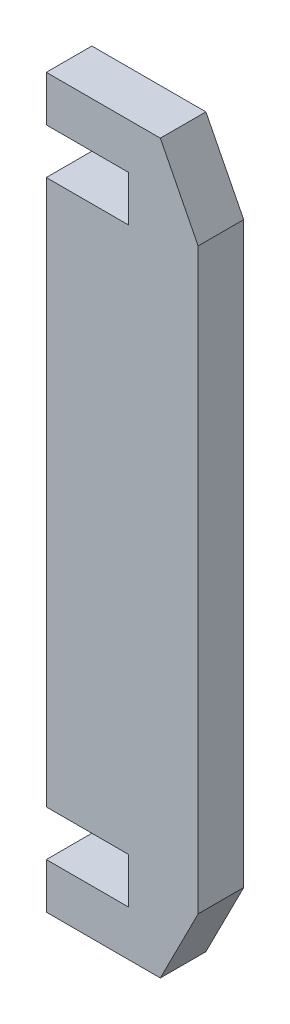
ISO-10303-21;
HEADER;
FILE_DESCRIPTION(('STEP AP214'),'2;1');
FILE_NAME('part.step','',(''),(''),'','','');
FILE_SCHEMA(('AUTOMOTIVE_DESIGN { 1 0 10303 214 1 1 1 1 }'));
ENDSEC;
DATA;
#1=APPLICATION_CONTEXT('core data for automotive mechanical design processes');
#2=APPLICATION_PROTOCOL_DEFINITION('international standard','automotive_design',2000,#1);
#3=PRODUCT_CONTEXT('',#1,'mechanical');
#4=PRODUCT('Part','Part','',(#3));
#5=PRODUCT_RELATED_PRODUCT_CATEGORY('part','',(#4));
#6=PRODUCT_DEFINITION_FORMATION('','',#4);
#7=PRODUCT_DEFINITION_CONTEXT('part definition',#1,'design');
#8=PRODUCT_DEFINITION('design','',#6,#7);
#9=PRODUCT_DEFINITION_SHAPE('','',#8);
#10=(LENGTH_UNIT() NAMED_UNIT(*) SI_UNIT(.MILLI.,.METRE.));
#11=(NAMED_UNIT(*) PLANE_ANGLE_UNIT() SI_UNIT($,.RADIAN.));
#12=(NAMED_UNIT(*) SI_UNIT($,.STERADIAN.) SOLID_ANGLE_UNIT());
#13=UNCERTAINTY_MEASURE_WITH_UNIT(LENGTH_MEASURE(1.E-05),#10,'distance_accuracy_value','');
#14=(GEOMETRIC_REPRESENTATION_CONTEXT(3) GLOBAL_UNCERTAINTY_ASSIGNED_CONTEXT((#13)) GLOBAL_UNIT_ASSIGNED_CONTEXT((#10,
#11,#12)) REPRESENTATION_CONTEXT('',''));
#15=CARTESIAN_POINT('',(0.,0.,0.));
#16=DIRECTION('',(0.,0.,1.));
#17=DIRECTION('',(1.,0.,0.));
#18=AXIS2_PLACEMENT_3D('',#15,#16,#17);
#19=CARTESIAN_POINT('',(872.909650659041,-119.420281102251,3.00000000000013));
#20=DIRECTION('',(0.,1.,0.));
#21=DIRECTION('',(0.,0.,0.999999999999999));
#22=AXIS2_PLACEMENT_3D('',#19,#20,#21);
#23=PLANE('',#22);
#24=DIRECTION('',(1.,0.,0.));
#25=VECTOR('',#24,1.);
#26=CARTESIAN_POINT('',(872.909650659041,-119.420281102251,1.45716771982052E-13));
#27=LINE('',#26,#25);
#28=CARTESIAN_POINT('',(872.909650659041,-119.420281102251,1.45716771982052E-13));
#29=VERTEX_POINT('',#28);
#30=CARTESIAN_POINT('',(880.419804328036,-119.420281102251,0.));
#31=VERTEX_POINT('',#30);
#32=EDGE_CURVE('E136',#29,#31,#27,.T.);
#33=ORIENTED_EDGE('',*,*,#32,.T.);
#34=DIRECTION('',(0.,0.,-0.999999999999999));
#35=VECTOR('',#34,1.);
#36=CARTESIAN_POINT('',(880.419804328036,-119.420281102251,3.00000000000008));
#37=LINE('',#36,#35);
#38=CARTESIAN_POINT('',(880.419804328036,-119.420281102251,3.00000000000008));
#39=VERTEX_POINT('',#38);
#40=EDGE_CURVE('E11',#39,#31,#37,.T.);
#41=ORIENTED_EDGE('',*,*,#40,.F.);
#42=DIRECTION('',(1.,0.,0.));
#43=VECTOR('',#42,1.);
#44=CARTESIAN_POINT('',(872.909650659041,-119.420281102251,3.00000000000013));
#45=LINE('',#44,#43);
#46=CARTESIAN_POINT('',(872.909650659041,-119.420281102251,3.00000000000013));
#47=VERTEX_POINT('',#46);
#48=EDGE_CURVE('E176',#47,#39,#45,.T.);
#49=ORIENTED_EDGE('',*,*,#48,.F.);
#50=DIRECTION('',(0.,0.,-0.999999999999999));
#51=VECTOR('',#50,1.);
#52=CARTESIAN_POINT('',(872.909650659041,-119.420281102251,3.00000000000013));
#53=LINE('',#52,#51);
#54=EDGE_CURVE('E149',#47,#29,#53,.T.);
#55=ORIENTED_EDGE('',*,*,#54,.T.);
#56=EDGE_LOOP('',(#33,#41,#49,#55));
#57=FACE_BOUND('',#56,.T.);
#58=ADVANCED_FACE('F32',(#57),#23,.F.);
#59=CARTESIAN_POINT('',(880.419804328036,-119.420281102251,3.00000000000008));
#60=DIRECTION('',(-0.891625628701499,0.452773385086465,0.));
#61=DIRECTION('',(-0.452773385086465,-0.891625628701499,0.));
#62=AXIS2_PLACEMENT_3D('',#59,#60,#61);
#63=PLANE('',#62);
#64=DIRECTION('',(0.452773385086465,0.891625628701499,0.));
#65=VECTOR('',#64,1.);
#66=CARTESIAN_POINT('',(880.419804328036,-119.420281102251,0.));
#67=LINE('',#66,#65);
#68=CARTESIAN_POINT('',(882.909650659041,-114.517142195734,1.38777878078145E-13));
#69=VERTEX_POINT('',#68);
#70=EDGE_CURVE('E132',#31,#69,#67,.T.);
#71=ORIENTED_EDGE('',*,*,#70,.T.);
#72=DIRECTION('',(0.,0.,-0.999999999999999));
#73=VECTOR('',#72,1.);
#74=CARTESIAN_POINT('',(882.909650659041,-114.517142195734,3.0000000000001));
#75=LINE('',#74,#73);
#76=CARTESIAN_POINT('',(882.909650659041,-114.517142195734,3.0000000000001));
#77=VERTEX_POINT('',#76);
#78=EDGE_CURVE('E39',#77,#69,#75,.T.);
#79=ORIENTED_EDGE('',*,*,#78,.F.);
#80=DIRECTION('',(0.452773385086465,0.891625628701499,0.));
#81=VECTOR('',#80,1.);
#82=CARTESIAN_POINT('',(880.419804328036,-119.420281102251,3.00000000000008));
#83=LINE('',#82,#81);
#84=EDGE_CURVE('E145',#39,#77,#83,.T.);
#85=ORIENTED_EDGE('',*,*,#84,.F.);
#86=ORIENTED_EDGE('',*,*,#40,.T.);
#87=EDGE_LOOP('',(#71,#79,#85,#86));
#88=FACE_BOUND('',#87,.T.);
#89=ADVANCED_FACE('F144',(#88),#63,.F.);
#90=CARTESIAN_POINT('',(882.909650659041,-114.517142195734,3.0000000000001));
#91=DIRECTION('',(-1.,0.,0.));
#92=DIRECTION('',(0.,0.,0.999999999999999));
#93=AXIS2_PLACEMENT_3D('',#90,#91,#92);
#94=PLANE('',#93);
#95=DIRECTION('',(0.,1.,0.));
#96=VECTOR('',#95,1.);
#97=CARTESIAN_POINT('',(882.909650659041,-114.517142195734,1.38777878078145E-13));
#98=LINE('',#97,#96);
#99=CARTESIAN_POINT('',(882.909650659041,-76.4234200087673,0.));
#100=VERTEX_POINT('',#99);
#101=EDGE_CURVE('E138',#69,#100,#98,.T.);
#102=ORIENTED_EDGE('',*,*,#101,.T.);
#103=DIRECTION('',(0.,0.,-0.999999999999999));
#104=VECTOR('',#103,1.);
#105=CARTESIAN_POINT('',(882.909650659041,-76.4234200087673,3.00000000000007));
#106=LINE('',#105,#104);
#107=CARTESIAN_POINT('',(882.909650659041,-76.4234200087673,3.00000000000007));
#108=VERTEX_POINT('',#107);
#109=EDGE_CURVE('E232',#108,#100,#106,.T.);
#110=ORIENTED_EDGE('',*,*,#109,.F.);
#111=DIRECTION('',(0.,1.,0.));
#112=VECTOR('',#111,1.);
#113=CARTESIAN_POINT('',(882.909650659041,-114.517142195734,3.0000000000001));
#114=LINE('',#113,#112);
#115=EDGE_CURVE('E179',#77,#108,#114,.T.);
#116=ORIENTED_EDGE('',*,*,#115,.F.);
#117=ORIENTED_EDGE('',*,*,#78,.T.);
#118=EDGE_LOOP('',(#102,#110,#116,#117));
#119=FACE_BOUND('',#118,.T.);
#120=ADVANCED_FACE('F236',(#119),#94,.F.);
#121=CARTESIAN_POINT('',(880.419804328036,-71.5202811022506,3.00000000000005));
#122=DIRECTION('',(-0.891625628701499,-0.452773385086465,0.));
#123=DIRECTION('',(0.452773385086465,-0.891625628701499,0.));
#124=AXIS2_PLACEMENT_3D('',#121,#122,#123);
#125=PLANE('',#124);
#126=DIRECTION('',(-0.452773385086465,0.891625628701499,0.));
#127=VECTOR('',#126,1.);
#128=CARTESIAN_POINT('',(880.419804328036,-71.5202811022506,0.));
#129=LINE('',#128,#127);
#130=CARTESIAN_POINT('',(880.419804328036,-71.5202811022506,0.));
#131=VERTEX_POINT('',#130);
#132=EDGE_CURVE('E153',#100,#131,#129,.T.);
#133=ORIENTED_EDGE('',*,*,#132,.T.);
#134=DIRECTION('',(0.,0.,-0.999999999999999));
#135=VECTOR('',#134,1.);
#136=CARTESIAN_POINT('',(880.419804328036,-71.5202811022506,3.00000000000005));
#137=LINE('',#136,#135);
#138=CARTESIAN_POINT('',(880.419804328036,-71.5202811022506,3.00000000000005));
#139=VERTEX_POINT('',#138);
#140=EDGE_CURVE('E229',#139,#131,#137,.T.);
#141=ORIENTED_EDGE('',*,*,#140,.F.);
#142=DIRECTION('',(-0.452773385086465,0.891625628701499,0.));
#143=VECTOR('',#142,1.);
#144=CARTESIAN_POINT('',(880.419804328036,-71.5202811022506,3.00000000000005));
#145=LINE('',#144,#143);
#146=EDGE_CURVE('E181',#108,#139,#145,.T.);
#147=ORIENTED_EDGE('',*,*,#146,.F.);
#148=ORIENTED_EDGE('',*,*,#109,.T.);
#149=EDGE_LOOP('',(#133,#141,#147,#148));
#150=FACE_BOUND('',#149,.T.);
#151=ADVANCED_FACE('F244',(#150),#125,.F.);
#152=CARTESIAN_POINT('',(872.909650659041,-71.5202811022506,3.00000000000014));
#153=DIRECTION('',(0.,-1.,0.));
#154=DIRECTION('',(0.,0.,-0.999999999999999));
#155=AXIS2_PLACEMENT_3D('',#152,#153,#154);
#156=PLANE('',#155);
#157=DIRECTION('',(-1.,0.,0.));
#158=VECTOR('',#157,1.);
#159=CARTESIAN_POINT('',(872.909650659041,-71.5202811022506,1.2490009027033E-13));
#160=LINE('',#159,#158);
#161=CARTESIAN_POINT('',(872.909650659041,-71.5202811022506,1.2490009027033E-13));
#162=VERTEX_POINT('',#161);
#163=EDGE_CURVE('E155',#131,#162,#160,.T.);
#164=ORIENTED_EDGE('',*,*,#163,.T.);
#165=DIRECTION('',(0.,0.,-0.999999999999999));
#166=VECTOR('',#165,1.);
#167=CARTESIAN_POINT('',(872.909650659041,-71.5202811022506,3.00000000000014));
#168=LINE('',#167,#166);
#169=CARTESIAN_POINT('',(872.909650659041,-71.5202811022506,3.00000000000014));
#170=VERTEX_POINT('',#169);
#171=EDGE_CURVE('E226',#170,#162,#168,.T.);
#172=ORIENTED_EDGE('',*,*,#171,.F.);
#173=DIRECTION('',(-1.,0.,0.));
#174=VECTOR('',#173,1.);
#175=CARTESIAN_POINT('',(872.909650659041,-71.5202811022506,3.00000000000014));
#176=LINE('',#175,#174);
#177=EDGE_CURVE('E183',#139,#170,#176,.T.);
#178=ORIENTED_EDGE('',*,*,#177,.F.);
#179=ORIENTED_EDGE('',*,*,#140,.T.);
#180=EDGE_LOOP('',(#164,#172,#178,#179));
#181=FACE_BOUND('',#180,.T.);
#182=ADVANCED_FACE('F247',(#181),#156,.F.);
#183=CARTESIAN_POINT('',(872.909650659041,-71.5202811022506,3.00000000000014));
#184=DIRECTION('',(1.,0.,0.));
#185=DIRECTION('',(0.,0.,-0.999999999999999));
#186=AXIS2_PLACEMENT_3D('',#183,#184,#185);
#187=PLANE('',#186);
#188=DIRECTION('',(0.,-1.,0.));
#189=VECTOR('',#188,1.);
#190=CARTESIAN_POINT('',(872.909650659041,-71.5202811022506,1.2490009027033E-13));
#191=LINE('',#190,#189);
#192=CARTESIAN_POINT('',(872.909650659041,-74.5202811022506,1.31838984174237E-13));
#193=VERTEX_POINT('',#192);
#194=EDGE_CURVE('E157',#162,#193,#191,.T.);
#195=ORIENTED_EDGE('',*,*,#194,.T.);
#196=DIRECTION('',(0.,0.,-0.999999999999999));
#197=VECTOR('',#196,1.);
#198=CARTESIAN_POINT('',(872.909650659041,-74.5202811022506,3.0000000000001));
#199=LINE('',#198,#197);
#200=CARTESIAN_POINT('',(872.909650659041,-74.5202811022506,3.0000000000001));
#201=VERTEX_POINT('',#200);
#202=EDGE_CURVE('E223',#201,#193,#199,.T.);
#203=ORIENTED_EDGE('',*,*,#202,.F.);
#204=DIRECTION('',(0.,-1.,0.));
#205=VECTOR('',#204,1.);
#206=CARTESIAN_POINT('',(872.909650659041,-71.5202811022506,3.00000000000014));
#207=LINE('',#206,#205);
#208=EDGE_CURVE('E185',#170,#201,#207,.T.);
#209=ORIENTED_EDGE('',*,*,#208,.F.);
#210=ORIENTED_EDGE('',*,*,#171,.T.);
#211=EDGE_LOOP('',(#195,#203,#209,#210));
#212=FACE_BOUND('',#211,.T.);
#213=ADVANCED_FACE('F252',(#212),#187,.F.);
#214=CARTESIAN_POINT('',(878.318576624196,-74.5202811022506,3.00000000000013));
#215=DIRECTION('',(0.,1.,0.));
#216=DIRECTION('',(0.,0.,0.999999999999999));
#217=AXIS2_PLACEMENT_3D('',#214,#215,#216);
#218=PLANE('',#217);
#219=DIRECTION('',(1.,0.,0.));
#220=VECTOR('',#219,1.);
#221=CARTESIAN_POINT('',(878.318576624196,-74.5202811022506,1.66533453693773E-13));
#222=LINE('',#221,#220);
#223=CARTESIAN_POINT('',(878.318576624196,-74.5202811022506,1.66533453693773E-13));
#224=VERTEX_POINT('',#223);
#225=EDGE_CURVE('E159',#193,#224,#222,.T.);
#226=ORIENTED_EDGE('',*,*,#225,.T.);
#227=DIRECTION('',(0.,0.,-0.999999999999999));
#228=VECTOR('',#227,1.);
#229=CARTESIAN_POINT('',(878.318576624196,-74.5202811022506,3.00000000000013));
#230=LINE('',#229,#228);
#231=CARTESIAN_POINT('',(878.318576624196,-74.5202811022506,3.00000000000013));
#232=VERTEX_POINT('',#231);
#233=EDGE_CURVE('E220',#232,#224,#230,.T.);
#234=ORIENTED_EDGE('',*,*,#233,.F.);
#235=DIRECTION('',(1.,0.,0.));
#236=VECTOR('',#235,1.);
#237=CARTESIAN_POINT('',(878.318576624196,-74.5202811022506,3.00000000000013));
#238=LINE('',#237,#236);
#239=EDGE_CURVE('E187',#201,#232,#238,.T.);
#240=ORIENTED_EDGE('',*,*,#239,.F.);
#241=ORIENTED_EDGE('',*,*,#202,.T.);
#242=EDGE_LOOP('',(#226,#234,#240,#241));
#243=FACE_BOUND('',#242,.T.);
#244=ADVANCED_FACE('F258',(#243),#218,.F.);
#245=CARTESIAN_POINT('',(878.318576624196,-74.5202811022506,3.00000000000013));
#246=DIRECTION('',(1.,0.,0.));
#247=DIRECTION('',(0.,0.,-0.999999999999999));
#248=AXIS2_PLACEMENT_3D('',#245,#246,#247);
#249=PLANE('',#248);
#250=DIRECTION('',(0.,-1.,0.));
#251=VECTOR('',#250,1.);
#252=CARTESIAN_POINT('',(878.318576624196,-74.5202811022506,1.66533453693773E-13));
#253=LINE('',#252,#251);
#254=CARTESIAN_POINT('',(878.318576624196,-77.5202811022506,1.52655665885959E-13));
#255=VERTEX_POINT('',#254);
#256=EDGE_CURVE('E161',#224,#255,#253,.T.);
#257=ORIENTED_EDGE('',*,*,#256,.T.);
#258=DIRECTION('',(0.,0.,-0.999999999999999));
#259=VECTOR('',#258,1.);
#260=CARTESIAN_POINT('',(878.318576624196,-77.5202811022506,3.00000000000014));
#261=LINE('',#260,#259);
#262=CARTESIAN_POINT('',(878.318576624196,-77.5202811022506,3.00000000000014));
#263=VERTEX_POINT('',#262);
#264=EDGE_CURVE('E217',#263,#255,#261,.T.);
#265=ORIENTED_EDGE('',*,*,#264,.F.);
#266=DIRECTION('',(0.,-1.,0.));
#267=VECTOR('',#266,1.);
#268=CARTESIAN_POINT('',(878.318576624196,-74.5202811022506,3.00000000000013));
#269=LINE('',#268,#267);
#270=EDGE_CURVE('E189',#232,#263,#269,.T.);
#271=ORIENTED_EDGE('',*,*,#270,.F.);
#272=ORIENTED_EDGE('',*,*,#233,.T.);
#273=EDGE_LOOP('',(#257,#265,#271,#272));
#274=FACE_BOUND('',#273,.T.);
#275=ADVANCED_FACE('F262',(#274),#249,.F.);
#276=CARTESIAN_POINT('',(872.909650659041,-77.5202811022505,3.00000000000017));
#277=DIRECTION('',(0.,-1.,0.));
#278=DIRECTION('',(0.,0.,-0.999999999999999));
#279=AXIS2_PLACEMENT_3D('',#276,#277,#278);
#280=PLANE('',#279);
#281=DIRECTION('',(-1.,0.,0.));
#282=VECTOR('',#281,1.);
#283=CARTESIAN_POINT('',(872.909650659041,-77.5202811022506,1.6306400674182E-13));
#284=LINE('',#283,#282);
#285=CARTESIAN_POINT('',(872.909650659041,-77.5202811022506,1.6306400674182E-13));
#286=VERTEX_POINT('',#285);
#287=EDGE_CURVE('E163',#255,#286,#284,.T.);
#288=ORIENTED_EDGE('',*,*,#287,.T.);
#289=DIRECTION('',(0.,0.,-0.999999999999999));
#290=VECTOR('',#289,1.);
#291=CARTESIAN_POINT('',(872.909650659041,-77.5202811022505,3.00000000000017));
#292=LINE('',#291,#290);
#293=CARTESIAN_POINT('',(872.909650659041,-77.5202811022505,3.00000000000017));
#294=VERTEX_POINT('',#293);
#295=EDGE_CURVE('E214',#294,#286,#292,.T.);
#296=ORIENTED_EDGE('',*,*,#295,.F.);
#297=DIRECTION('',(-1.,0.,0.));
#298=VECTOR('',#297,1.);
#299=CARTESIAN_POINT('',(872.909650659041,-77.5202811022505,3.00000000000017));
#300=LINE('',#299,#298);
#301=EDGE_CURVE('E191',#263,#294,#300,.T.);
#302=ORIENTED_EDGE('',*,*,#301,.F.);
#303=ORIENTED_EDGE('',*,*,#264,.T.);
#304=EDGE_LOOP('',(#288,#296,#302,#303));
#305=FACE_BOUND('',#304,.T.);
#306=ADVANCED_FACE('F267',(#305),#280,.F.);
#307=CARTESIAN_POINT('',(872.909650659041,-113.420281102251,3.00000000000015));
#308=DIRECTION('',(1.,0.,0.));
#309=DIRECTION('',(0.,0.,-0.999999999999999));
#310=AXIS2_PLACEMENT_3D('',#307,#308,#309);
#311=PLANE('',#310);
#312=DIRECTION('',(0.,-1.,0.));
#313=VECTOR('',#312,1.);
#314=CARTESIAN_POINT('',(872.909650659041,-113.420281102251,1.28369537222284E-13));
#315=LINE('',#314,#313);
#316=CARTESIAN_POINT('',(872.909650659041,-113.420281102251,1.28369537222284E-13));
#317=VERTEX_POINT('',#316);
#318=EDGE_CURVE('E166',#286,#317,#315,.T.);
#319=ORIENTED_EDGE('',*,*,#318,.T.);
#320=DIRECTION('',(0.,0.,-0.999999999999999));
#321=VECTOR('',#320,1.);
#322=CARTESIAN_POINT('',(872.909650659041,-113.420281102251,3.00000000000015));
#323=LINE('',#322,#321);
#324=CARTESIAN_POINT('',(872.909650659041,-113.420281102251,3.00000000000015));
#325=VERTEX_POINT('',#324);
#326=EDGE_CURVE('E211',#325,#317,#323,.T.);
#327=ORIENTED_EDGE('',*,*,#326,.F.);
#328=DIRECTION('',(0.,-1.,0.));
#329=VECTOR('',#328,1.);
#330=CARTESIAN_POINT('',(872.909650659041,-77.5202811022505,3.00000000000017));
#331=LINE('',#330,#329);
#332=EDGE_CURVE('E193',#294,#325,#331,.T.);
#333=ORIENTED_EDGE('',*,*,#332,.F.);
#334=ORIENTED_EDGE('',*,*,#295,.T.);
#335=EDGE_LOOP('',(#319,#327,#333,#334));
#336=FACE_BOUND('',#335,.T.);
#337=ADVANCED_FACE('F273',(#336),#311,.F.);
#338=CARTESIAN_POINT('',(872.909650659041,-113.420281102251,3.00000000000015));
#339=DIRECTION('',(0.,1.,0.));
#340=DIRECTION('',(-1.,0.,0.));
#341=AXIS2_PLACEMENT_3D('',#338,#339,#340);
#342=PLANE('',#341);
#343=DIRECTION('',(1.,0.,0.));
#344=VECTOR('',#343,1.);
#345=CARTESIAN_POINT('',(872.909650659041,-113.420281102251,1.28369537222284E-13));
#346=LINE('',#345,#344);
#347=CARTESIAN_POINT('',(878.318576624196,-113.420281102251,0.));
#348=VERTEX_POINT('',#347);
#349=EDGE_CURVE('E168',#317,#348,#346,.T.);
#350=ORIENTED_EDGE('',*,*,#349,.T.);
#351=DIRECTION('',(0.,0.,-0.999999999999999));
#352=VECTOR('',#351,1.);
#353=CARTESIAN_POINT('',(878.318576624196,-113.420281102251,3.00000000000007));
#354=LINE('',#353,#352);
#355=CARTESIAN_POINT('',(878.318576624196,-113.420281102251,3.00000000000007));
#356=VERTEX_POINT('',#355);
#357=EDGE_CURVE('E208',#356,#348,#354,.T.);
#358=ORIENTED_EDGE('',*,*,#357,.F.);
#359=DIRECTION('',(1.,0.,0.));
#360=VECTOR('',#359,1.);
#361=CARTESIAN_POINT('',(872.909650659041,-113.420281102251,3.00000000000015));
#362=LINE('',#361,#360);
#363=EDGE_CURVE('E195',#325,#356,#362,.T.);
#364=ORIENTED_EDGE('',*,*,#363,.F.);
#365=ORIENTED_EDGE('',*,*,#326,.T.);
#366=EDGE_LOOP('',(#350,#358,#364,#365));
#367=FACE_BOUND('',#366,.T.);
#368=ADVANCED_FACE('F276',(#367),#342,.F.);
#369=CARTESIAN_POINT('',(878.318576624196,-113.420281102251,3.00000000000007));
#370=DIRECTION('',(1.,0.,0.));
#371=DIRECTION('',(0.,0.,-0.999999999999999));
#372=AXIS2_PLACEMENT_3D('',#369,#370,#371);
#373=PLANE('',#372);
#374=DIRECTION('',(0.,-1.,0.));
#375=VECTOR('',#374,1.);
#376=CARTESIAN_POINT('',(878.318576624196,-113.420281102251,0.));
#377=LINE('',#376,#375);
#378=CARTESIAN_POINT('',(878.318576624196,-116.420281102251,1.00613961606655E-13));
#379=VERTEX_POINT('',#378);
#380=EDGE_CURVE('E170',#348,#379,#377,.T.);
#381=ORIENTED_EDGE('',*,*,#380,.T.);
#382=DIRECTION('',(0.,0.,-0.999999999999999));
#383=VECTOR('',#382,1.);
#384=CARTESIAN_POINT('',(878.318576624196,-116.420281102251,3.00000000000012));
#385=LINE('',#384,#383);
#386=CARTESIAN_POINT('',(878.318576624196,-116.420281102251,3.00000000000012));
#387=VERTEX_POINT('',#386);
#388=EDGE_CURVE('E205',#387,#379,#385,.T.);
#389=ORIENTED_EDGE('',*,*,#388,.F.);
#390=DIRECTION('',(0.,-1.,0.));
#391=VECTOR('',#390,1.);
#392=CARTESIAN_POINT('',(878.318576624196,-113.420281102251,3.00000000000007));
#393=LINE('',#392,#391);
#394=EDGE_CURVE('E197',#356,#387,#393,.T.);
#395=ORIENTED_EDGE('',*,*,#394,.F.);
#396=ORIENTED_EDGE('',*,*,#357,.T.);
#397=EDGE_LOOP('',(#381,#389,#395,#396));
#398=FACE_BOUND('',#397,.T.);
#399=ADVANCED_FACE('F281',(#398),#373,.F.);
#400=CARTESIAN_POINT('',(878.318576624196,-116.420281102251,3.00000000000012));
#401=DIRECTION('',(0.,-1.,0.));
#402=DIRECTION('',(0.,0.,-0.999999999999999));
#403=AXIS2_PLACEMENT_3D('',#400,#401,#402);
#404=PLANE('',#403);
#405=DIRECTION('',(-1.,0.,0.));
#406=VECTOR('',#405,1.);
#407=CARTESIAN_POINT('',(878.318576624196,-116.420281102251,1.00613961606655E-13));
#408=LINE('',#407,#406);
#409=CARTESIAN_POINT('',(872.909650659041,-116.420281102251,1.45716771982052E-13));
#410=VERTEX_POINT('',#409);
#411=EDGE_CURVE('E172',#379,#410,#408,.T.);
#412=ORIENTED_EDGE('',*,*,#411,.T.);
#413=DIRECTION('',(0.,0.,-0.999999999999999));
#414=VECTOR('',#413,1.);
#415=CARTESIAN_POINT('',(872.909650659041,-116.420281102251,3.00000000000013));
#416=LINE('',#415,#414);
#417=CARTESIAN_POINT('',(872.909650659041,-116.420281102251,3.00000000000013));
#418=VERTEX_POINT('',#417);
#419=EDGE_CURVE('E202',#418,#410,#416,.T.);
#420=ORIENTED_EDGE('',*,*,#419,.F.);
#421=DIRECTION('',(-1.,0.,0.));
#422=VECTOR('',#421,1.);
#423=CARTESIAN_POINT('',(878.318576624196,-116.420281102251,3.00000000000012));
#424=LINE('',#423,#422);
#425=EDGE_CURVE('E51',#387,#418,#424,.T.);
#426=ORIENTED_EDGE('',*,*,#425,.F.);
#427=ORIENTED_EDGE('',*,*,#388,.T.);
#428=EDGE_LOOP('',(#412,#420,#426,#427));
#429=FACE_BOUND('',#428,.T.);
#430=ADVANCED_FACE('F284',(#429),#404,.F.);
#431=CARTESIAN_POINT('',(872.909650659041,-116.420281102251,3.00000000000013));
#432=DIRECTION('',(1.,0.,0.));
#433=DIRECTION('',(0.,0.,-0.999999999999999));
#434=AXIS2_PLACEMENT_3D('',#431,#432,#433);
#435=PLANE('',#434);
#436=DIRECTION('',(0.,-1.,0.));
#437=VECTOR('',#436,1.);
#438=CARTESIAN_POINT('',(872.909650659041,-116.420281102251,1.45716771982052E-13));
#439=LINE('',#438,#437);
#440=EDGE_CURVE('E174',#410,#29,#439,.T.);
#441=ORIENTED_EDGE('',*,*,#440,.T.);
#442=ORIENTED_EDGE('',*,*,#54,.F.);
#443=DIRECTION('',(0.,-1.,0.));
#444=VECTOR('',#443,1.);
#445=CARTESIAN_POINT('',(872.909650659041,-116.420281102251,3.00000000000013));
#446=LINE('',#445,#444);
#447=EDGE_CURVE('E46',#418,#47,#446,.T.);
#448=ORIENTED_EDGE('',*,*,#447,.F.);
#449=ORIENTED_EDGE('',*,*,#419,.T.);
#450=EDGE_LOOP('',(#441,#442,#448,#449));
#451=FACE_BOUND('',#450,.T.);
#452=ADVANCED_FACE('F286',(#451),#435,.F.);
#453=CARTESIAN_POINT('',(882.909650659041,-119.420281102251,3.00000000000008));
#454=DIRECTION('',(0.,0.,0.999999999999999));
#455=DIRECTION('',(1.,0.,0.));
#456=AXIS2_PLACEMENT_3D('',#453,#454,#455);
#457=PLANE('',#456);
#458=ORIENTED_EDGE('',*,*,#48,.T.);
#459=ORIENTED_EDGE('',*,*,#84,.T.);
#460=ORIENTED_EDGE('',*,*,#115,.T.);
#461=ORIENTED_EDGE('',*,*,#146,.T.);
#462=ORIENTED_EDGE('',*,*,#177,.T.);
#463=ORIENTED_EDGE('',*,*,#208,.T.);
#464=ORIENTED_EDGE('',*,*,#239,.T.);
#465=ORIENTED_EDGE('',*,*,#270,.T.);
#466=ORIENTED_EDGE('',*,*,#301,.T.);
#467=ORIENTED_EDGE('',*,*,#332,.T.);
#468=ORIENTED_EDGE('',*,*,#363,.T.);
#469=ORIENTED_EDGE('',*,*,#394,.T.);
#470=ORIENTED_EDGE('',*,*,#425,.T.);
#471=ORIENTED_EDGE('',*,*,#447,.T.);
#472=EDGE_LOOP('',(#458,#459,#460,#461,#462,#463,#464,#465,#466,#467,#468,#469,#470,#471));
#473=FACE_BOUND('',#472,.T.);
#474=ADVANCED_FACE('F239',(#473),#457,.T.);
#475=CARTESIAN_POINT('',(882.909650659041,-119.420281102251,1.31838984174237E-13));
#476=DIRECTION('',(0.,0.,0.999999999999999));
#477=DIRECTION('',(1.,0.,0.));
#478=AXIS2_PLACEMENT_3D('',#475,#476,#477);
#479=PLANE('',#478);
#480=ORIENTED_EDGE('',*,*,#32,.F.);
#481=ORIENTED_EDGE('',*,*,#440,.F.);
#482=ORIENTED_EDGE('',*,*,#411,.F.);
#483=ORIENTED_EDGE('',*,*,#380,.F.);
#484=ORIENTED_EDGE('',*,*,#349,.F.);
#485=ORIENTED_EDGE('',*,*,#318,.F.);
#486=ORIENTED_EDGE('',*,*,#287,.F.);
#487=ORIENTED_EDGE('',*,*,#256,.F.);
#488=ORIENTED_EDGE('',*,*,#225,.F.);
#489=ORIENTED_EDGE('',*,*,#194,.F.);
#490=ORIENTED_EDGE('',*,*,#163,.F.);
#491=ORIENTED_EDGE('',*,*,#132,.F.);
#492=ORIENTED_EDGE('',*,*,#101,.F.);
#493=ORIENTED_EDGE('',*,*,#70,.F.);
#494=EDGE_LOOP('',(#480,#481,#482,#483,#484,#485,#486,#487,#488,#489,#490,#491,#492,#493));
#495=FACE_BOUND('',#494,.T.);
#496=ADVANCED_FACE('F133',(#495),#479,.F.);
#497=CLOSED_SHELL('',(#58,#89,#120,#151,#182,#213,#244,#275,#306,#337,#368,#399,#430,#452,#474,#496));
#498=MANIFOLD_SOLID_BREP('B2',#497);
#499=ADVANCED_BREP_SHAPE_REPRESENTATION('',(#18,#498),#14);
#500=SHAPE_DEFINITION_REPRESENTATION(#9,#499);
ENDSEC;
END-ISO-10303-21;
